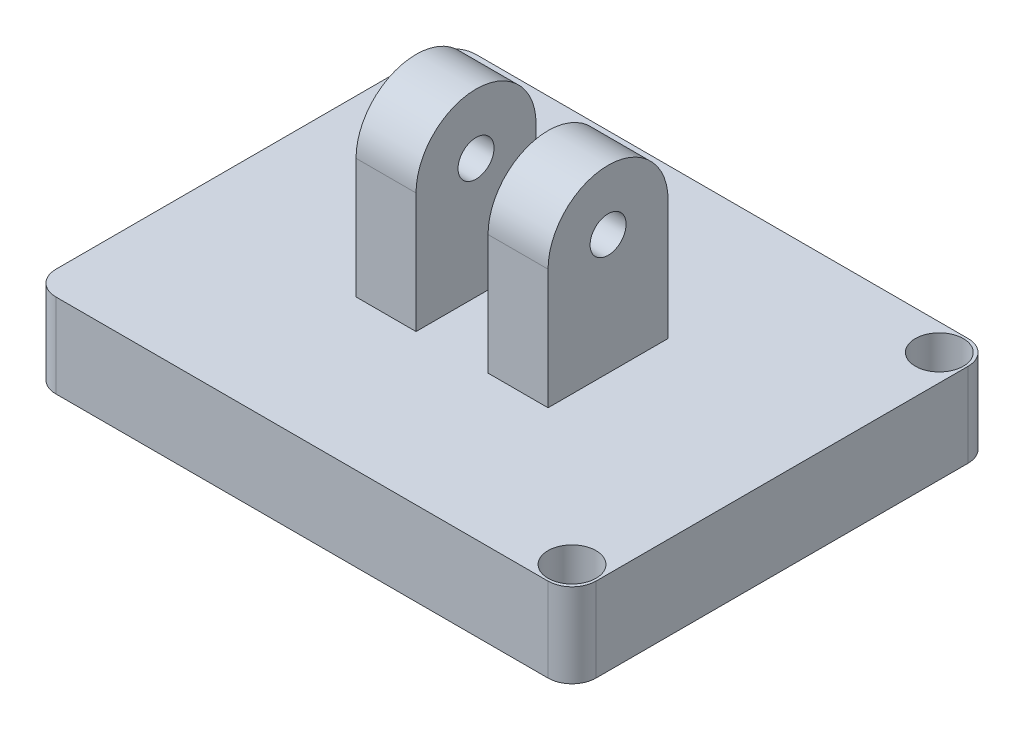
ISO-10303-21;
HEADER;
FILE_DESCRIPTION(('STEP AP214'),'2;1');
FILE_NAME('part.step','',(''),(''),'','','');
FILE_SCHEMA(('AUTOMOTIVE_DESIGN { 1 0 10303 214 1 1 1 1 }'));
ENDSEC;
DATA;
#1=APPLICATION_CONTEXT('core data for automotive mechanical design processes');
#2=APPLICATION_PROTOCOL_DEFINITION('international standard','automotive_design',2000,#1);
#3=PRODUCT_CONTEXT('',#1,'mechanical');
#4=PRODUCT('Part','Part','',(#3));
#5=PRODUCT_RELATED_PRODUCT_CATEGORY('part','',(#4));
#6=PRODUCT_DEFINITION_FORMATION('','',#4);
#7=PRODUCT_DEFINITION_CONTEXT('part definition',#1,'design');
#8=PRODUCT_DEFINITION('design','',#6,#7);
#9=PRODUCT_DEFINITION_SHAPE('','',#8);
#10=(LENGTH_UNIT() NAMED_UNIT(*) SI_UNIT(.MILLI.,.METRE.));
#11=(NAMED_UNIT(*) PLANE_ANGLE_UNIT() SI_UNIT($,.RADIAN.));
#12=(NAMED_UNIT(*) SI_UNIT($,.STERADIAN.) SOLID_ANGLE_UNIT());
#13=UNCERTAINTY_MEASURE_WITH_UNIT(LENGTH_MEASURE(1.E-05),#10,'distance_accuracy_value','');
#14=(GEOMETRIC_REPRESENTATION_CONTEXT(3) GLOBAL_UNCERTAINTY_ASSIGNED_CONTEXT((#13)) GLOBAL_UNIT_ASSIGNED_CONTEXT((#10,
#11,#12)) REPRESENTATION_CONTEXT('',''));
#15=CARTESIAN_POINT('',(0.,0.,0.));
#16=DIRECTION('',(0.,0.,1.));
#17=DIRECTION('',(1.,0.,0.));
#18=AXIS2_PLACEMENT_3D('',#15,#16,#17);
#19=CARTESIAN_POINT('',(8.,17.,-5.00500000000001));
#20=DIRECTION('',(0.,0.,1.));
#21=DIRECTION('',(0.,-1.,0.));
#22=AXIS2_PLACEMENT_3D('',#19,#20,#21);
#23=PLANE('',#22);
#24=DIRECTION('',(0.,1.,0.));
#25=VECTOR('',#24,1.);
#26=CARTESIAN_POINT('',(-3.,17.,-5.00500000000001));
#27=LINE('',#26,#25);
#28=CARTESIAN_POINT('',(-3.,7.,-5.00500000000001));
#29=VERTEX_POINT('',#28);
#30=CARTESIAN_POINT('',(-3.,17.,-5.00500000000001));
#31=VERTEX_POINT('',#30);
#32=EDGE_CURVE('E153',#29,#31,#27,.T.);
#33=ORIENTED_EDGE('',*,*,#32,.F.);
#34=DIRECTION('',(-1.,0.,0.));
#35=VECTOR('',#34,1.);
#36=CARTESIAN_POINT('',(8.,7.,-5.00500000000001));
#37=LINE('',#36,#35);
#38=CARTESIAN_POINT('',(-8.,7.,-5.00500000000001));
#39=VERTEX_POINT('',#38);
#40=EDGE_CURVE('E164',#29,#39,#37,.T.);
#41=ORIENTED_EDGE('',*,*,#40,.T.);
#42=DIRECTION('',(0.,1.,0.));
#43=VECTOR('',#42,1.);
#44=CARTESIAN_POINT('',(-8.,17.,-5.00500000000001));
#45=LINE('',#44,#43);
#46=CARTESIAN_POINT('',(-8.,17.,-5.00500000000001));
#47=VERTEX_POINT('',#46);
#48=EDGE_CURVE('E340',#39,#47,#45,.T.);
#49=ORIENTED_EDGE('',*,*,#48,.T.);
#50=DIRECTION('',(-1.,0.,0.));
#51=VECTOR('',#50,1.);
#52=CARTESIAN_POINT('',(8.,17.,-5.00500000000001));
#53=LINE('',#52,#51);
#54=EDGE_CURVE('E166',#31,#47,#53,.T.);
#55=ORIENTED_EDGE('',*,*,#54,.F.);
#56=EDGE_LOOP('',(#33,#41,#49,#55));
#57=FACE_BOUND('',#56,.T.);
#58=ADVANCED_FACE('F38',(#57),#23,.F.);
#59=CARTESIAN_POINT('',(8.,17.,-0.00500000000000671));
#60=DIRECTION('',(-1.,0.,0.));
#61=DIRECTION('',(0.,0.,1.));
#62=AXIS2_PLACEMENT_3D('',#59,#60,#61);
#63=CYLINDRICAL_SURFACE('',#62,5.);
#64=CARTESIAN_POINT('',(-3.,17.,-0.00500000000000734));
#65=DIRECTION('',(1.,0.,0.));
#66=DIRECTION('',(0.,0.,-1.));
#67=AXIS2_PLACEMENT_3D('',#64,#65,#66);
#68=CIRCLE('',#67,5.);
#69=CARTESIAN_POINT('',(-3.,17.,4.99499999999999));
#70=VERTEX_POINT('',#69);
#71=EDGE_CURVE('E167',#31,#70,#68,.T.);
#72=ORIENTED_EDGE('',*,*,#71,.F.);
#73=ORIENTED_EDGE('',*,*,#54,.T.);
#74=CARTESIAN_POINT('',(-8.,17.,-0.00500000000000763));
#75=DIRECTION('',(1.,0.,0.));
#76=DIRECTION('',(0.,0.,-1.));
#77=AXIS2_PLACEMENT_3D('',#74,#75,#76);
#78=CIRCLE('',#77,5.);
#79=CARTESIAN_POINT('',(-8.,17.,4.99499999999999));
#80=VERTEX_POINT('',#79);
#81=EDGE_CURVE('E342',#47,#80,#78,.T.);
#82=ORIENTED_EDGE('',*,*,#81,.T.);
#83=DIRECTION('',(-1.,0.,0.));
#84=VECTOR('',#83,1.);
#85=CARTESIAN_POINT('',(8.,17.,4.99499999999999));
#86=LINE('',#85,#84);
#87=EDGE_CURVE('E349',#70,#80,#86,.T.);
#88=ORIENTED_EDGE('',*,*,#87,.F.);
#89=EDGE_LOOP('',(#72,#73,#82,#88));
#90=FACE_BOUND('',#89,.T.);
#91=ADVANCED_FACE('F292',(#90),#63,.T.);
#92=CARTESIAN_POINT('',(8.,7.,4.99499999999999));
#93=DIRECTION('',(0.,0.,-1.));
#94=DIRECTION('',(-1.,0.,0.));
#95=AXIS2_PLACEMENT_3D('',#92,#93,#94);
#96=PLANE('',#95);
#97=DIRECTION('',(0.,-1.,0.));
#98=VECTOR('',#97,1.);
#99=CARTESIAN_POINT('',(-3.,7.,4.99499999999999));
#100=LINE('',#99,#98);
#101=CARTESIAN_POINT('',(-3.,7.,4.99499999999999));
#102=VERTEX_POINT('',#101);
#103=EDGE_CURVE('E156',#70,#102,#100,.T.);
#104=ORIENTED_EDGE('',*,*,#103,.F.);
#105=ORIENTED_EDGE('',*,*,#87,.T.);
#106=DIRECTION('',(0.,-1.,0.));
#107=VECTOR('',#106,1.);
#108=CARTESIAN_POINT('',(-8.,7.,4.99499999999999));
#109=LINE('',#108,#107);
#110=CARTESIAN_POINT('',(-8.,7.,4.99499999999999));
#111=VERTEX_POINT('',#110);
#112=EDGE_CURVE('E331',#80,#111,#109,.T.);
#113=ORIENTED_EDGE('',*,*,#112,.T.);
#114=DIRECTION('',(-1.,0.,0.));
#115=VECTOR('',#114,1.);
#116=CARTESIAN_POINT('',(8.,7.,4.99499999999999));
#117=LINE('',#116,#115);
#118=EDGE_CURVE('E339',#102,#111,#117,.T.);
#119=ORIENTED_EDGE('',*,*,#118,.F.);
#120=EDGE_LOOP('',(#104,#105,#113,#119));
#121=FACE_BOUND('',#120,.T.);
#122=ADVANCED_FACE('F298',(#121),#96,.F.);
#123=CARTESIAN_POINT('',(8.,17.,-0.00500000000000671));
#124=DIRECTION('',(-1.,0.,0.));
#125=DIRECTION('',(0.,0.,1.));
#126=AXIS2_PLACEMENT_3D('',#123,#124,#125);
#127=CYLINDRICAL_SURFACE('',#126,1.5);
#128=CARTESIAN_POINT('',(-8.,17.,-0.00500000000000763));
#129=DIRECTION('',(1.,0.,0.));
#130=DIRECTION('',(0.,0.,-1.));
#131=AXIS2_PLACEMENT_3D('',#128,#129,#130);
#132=CIRCLE('',#131,1.5);
#133=CARTESIAN_POINT('',(-8.,17.,-1.50500000000001));
#134=VERTEX_POINT('',#133);
#135=EDGE_CURVE('E334',#134,#134,#132,.T.);
#136=ORIENTED_EDGE('',*,*,#135,.F.);
#137=EDGE_LOOP('',(#136));
#138=FACE_BOUND('',#137,.T.);
#139=CARTESIAN_POINT('',(-3.,17.,-0.00500000000000734));
#140=DIRECTION('',(1.,0.,0.));
#141=DIRECTION('',(0.,0.,-1.));
#142=AXIS2_PLACEMENT_3D('',#139,#140,#141);
#143=CIRCLE('',#142,1.5);
#144=CARTESIAN_POINT('',(-3.,17.,-1.50500000000001));
#145=VERTEX_POINT('',#144);
#146=EDGE_CURVE('E368',#145,#145,#143,.T.);
#147=ORIENTED_EDGE('',*,*,#146,.T.);
#148=EDGE_LOOP('',(#147));
#149=FACE_BOUND('',#148,.T.);
#150=ADVANCED_FACE('F382',(#138,#149),#127,.F.);
#151=CARTESIAN_POINT('',(0.,7.,0.));
#152=DIRECTION('',(0.,-1.,0.));
#153=DIRECTION('',(0.,0.,-1.));
#154=AXIS2_PLACEMENT_3D('',#151,#152,#153);
#155=PLANE('',#154);
#156=DIRECTION('',(0.,0.,-1.));
#157=VECTOR('',#156,1.);
#158=CARTESIAN_POINT('',(3.,7.,-0.00500000000000613));
#159=LINE('',#158,#157);
#160=CARTESIAN_POINT('',(3.,7.,4.99499999999999));
#161=VERTEX_POINT('',#160);
#162=CARTESIAN_POINT('',(3.,7.,-5.00500000000001));
#163=VERTEX_POINT('',#162);
#164=EDGE_CURVE('E53',#161,#163,#159,.T.);
#165=ORIENTED_EDGE('',*,*,#164,.T.);
#166=CARTESIAN_POINT('',(8.,7.,-5.00500000000001));
#167=VERTEX_POINT('',#166);
#168=EDGE_CURVE('E60',#167,#163,#37,.T.);
#169=ORIENTED_EDGE('',*,*,#168,.F.);
#170=DIRECTION('',(0.,0.,-1.));
#171=VECTOR('',#170,1.);
#172=CARTESIAN_POINT('',(8.,7.,-5.00500000000001));
#173=LINE('',#172,#171);
#174=CARTESIAN_POINT('',(8.,7.,4.99499999999999));
#175=VERTEX_POINT('',#174);
#176=EDGE_CURVE('E322',#175,#167,#173,.T.);
#177=ORIENTED_EDGE('',*,*,#176,.F.);
#178=EDGE_CURVE('E348',#175,#161,#117,.T.);
#179=ORIENTED_EDGE('',*,*,#178,.T.);
#180=EDGE_LOOP('',(#165,#169,#177,#179));
#181=FACE_BOUND('',#180,.T.);
#182=DIRECTION('',(-1.,0.,0.));
#183=VECTOR('',#182,1.);
#184=CARTESIAN_POINT('',(-22.5,7.,-17.5));
#185=LINE('',#184,#183);
#186=CARTESIAN_POINT('',(20.5,7.,-17.5));
#187=VERTEX_POINT('',#186);
#188=CARTESIAN_POINT('',(-20.5,7.,-17.5));
#189=VERTEX_POINT('',#188);
#190=EDGE_CURVE('E195',#187,#189,#185,.T.);
#191=ORIENTED_EDGE('',*,*,#190,.T.);
#192=CARTESIAN_POINT('',(-20.5,7.,-15.5));
#193=DIRECTION('',(0.,-1.,0.));
#194=DIRECTION('',(0.,0.,-1.));
#195=AXIS2_PLACEMENT_3D('',#192,#193,#194);
#196=CIRCLE('',#195,2.);
#197=CARTESIAN_POINT('',(-22.5,7.,-15.5));
#198=VERTEX_POINT('',#197);
#199=EDGE_CURVE('E239',#189,#198,#196,.F.);
#200=ORIENTED_EDGE('',*,*,#199,.T.);
#201=DIRECTION('',(0.,0.,1.));
#202=VECTOR('',#201,1.);
#203=CARTESIAN_POINT('',(-22.5,7.,17.5));
#204=LINE('',#203,#202);
#205=CARTESIAN_POINT('',(-22.5,7.,15.5));
#206=VERTEX_POINT('',#205);
#207=EDGE_CURVE('E199',#198,#206,#204,.T.);
#208=ORIENTED_EDGE('',*,*,#207,.T.);
#209=CARTESIAN_POINT('',(-20.5,7.,15.5));
#210=DIRECTION('',(0.,-1.,0.));
#211=DIRECTION('',(0.,0.,-1.));
#212=AXIS2_PLACEMENT_3D('',#209,#210,#211);
#213=CIRCLE('',#212,2.);
#214=CARTESIAN_POINT('',(-20.5,7.,17.5));
#215=VERTEX_POINT('',#214);
#216=EDGE_CURVE('E235',#206,#215,#213,.F.);
#217=ORIENTED_EDGE('',*,*,#216,.T.);
#218=DIRECTION('',(1.,0.,0.));
#219=VECTOR('',#218,1.);
#220=CARTESIAN_POINT('',(-22.5,7.,17.5));
#221=LINE('',#220,#219);
#222=CARTESIAN_POINT('',(20.5,7.,17.5));
#223=VERTEX_POINT('',#222);
#224=EDGE_CURVE('E202',#215,#223,#221,.T.);
#225=ORIENTED_EDGE('',*,*,#224,.T.);
#226=CARTESIAN_POINT('',(20.5,7.,15.5));
#227=DIRECTION('',(0.,-1.,0.));
#228=DIRECTION('',(0.,0.,-1.));
#229=AXIS2_PLACEMENT_3D('',#226,#227,#228);
#230=CIRCLE('',#229,2.);
#231=CARTESIAN_POINT('',(22.5,7.,15.5));
#232=VERTEX_POINT('',#231);
#233=EDGE_CURVE('E233',#223,#232,#230,.F.);
#234=ORIENTED_EDGE('',*,*,#233,.T.);
#235=DIRECTION('',(0.,0.,-1.));
#236=VECTOR('',#235,1.);
#237=CARTESIAN_POINT('',(22.5,7.,17.5));
#238=LINE('',#237,#236);
#239=CARTESIAN_POINT('',(22.5,7.,-15.5));
#240=VERTEX_POINT('',#239);
#241=EDGE_CURVE('E192',#232,#240,#238,.T.);
#242=ORIENTED_EDGE('',*,*,#241,.T.);
#243=CARTESIAN_POINT('',(20.5,7.,-15.5));
#244=DIRECTION('',(0.,-1.,0.));
#245=DIRECTION('',(0.,0.,-1.));
#246=AXIS2_PLACEMENT_3D('',#243,#244,#245);
#247=CIRCLE('',#246,2.);
#248=EDGE_CURVE('E237',#240,#187,#247,.F.);
#249=ORIENTED_EDGE('',*,*,#248,.T.);
#250=EDGE_LOOP('',(#191,#200,#208,#217,#225,#234,#242,#249));
#251=FACE_BOUND('',#250,.T.);
#252=CARTESIAN_POINT('',(20.3,7.,15.3));
#253=DIRECTION('',(0.,1.,0.));
#254=DIRECTION('',(0.,0.,1.));
#255=AXIS2_PLACEMENT_3D('',#252,#253,#254);
#256=CIRCLE('',#255,2.);
#257=CARTESIAN_POINT('',(20.3,7.,17.3));
#258=VERTEX_POINT('',#257);
#259=EDGE_CURVE('E175',#258,#258,#256,.T.);
#260=ORIENTED_EDGE('',*,*,#259,.F.);
#261=EDGE_LOOP('',(#260));
#262=FACE_BOUND('',#261,.T.);
#263=CARTESIAN_POINT('',(20.3,7.,-15.3));
#264=DIRECTION('',(0.,1.,0.));
#265=DIRECTION('',(0.,0.,1.));
#266=AXIS2_PLACEMENT_3D('',#263,#264,#265);
#267=CIRCLE('',#266,2.);
#268=CARTESIAN_POINT('',(20.3,7.,-13.3));
#269=VERTEX_POINT('',#268);
#270=EDGE_CURVE('E184',#269,#269,#267,.T.);
#271=ORIENTED_EDGE('',*,*,#270,.F.);
#272=EDGE_LOOP('',(#271));
#273=FACE_BOUND('',#272,.T.);
#274=ORIENTED_EDGE('',*,*,#40,.F.);
#275=DIRECTION('',(0.,0.,-1.));
#276=VECTOR('',#275,1.);
#277=CARTESIAN_POINT('',(-3.,7.,-5.00500000000001));
#278=LINE('',#277,#276);
#279=EDGE_CURVE('E150',#102,#29,#278,.T.);
#280=ORIENTED_EDGE('',*,*,#279,.F.);
#281=ORIENTED_EDGE('',*,*,#118,.T.);
#282=DIRECTION('',(0.,0.,-1.));
#283=VECTOR('',#282,1.);
#284=CARTESIAN_POINT('',(-8.,7.,-0.00500000000000676));
#285=LINE('',#284,#283);
#286=EDGE_CURVE('E171',#111,#39,#285,.T.);
#287=ORIENTED_EDGE('',*,*,#286,.T.);
#288=EDGE_LOOP('',(#274,#280,#281,#287));
#289=FACE_BOUND('',#288,.T.);
#290=ADVANCED_FACE('F169',(#181,#251,#262,#273,#289),#155,.F.);
#291=CARTESIAN_POINT('',(22.5,7.,17.5));
#292=DIRECTION('',(-1.,0.,0.));
#293=DIRECTION('',(0.,0.,1.));
#294=AXIS2_PLACEMENT_3D('',#291,#292,#293);
#295=PLANE('',#294);
#296=DIRECTION('',(0.,0.,-1.));
#297=VECTOR('',#296,1.);
#298=CARTESIAN_POINT('',(22.5,0.,17.5));
#299=LINE('',#298,#297);
#300=CARTESIAN_POINT('',(22.5,0.,15.5));
#301=VERTEX_POINT('',#300);
#302=CARTESIAN_POINT('',(22.5,0.,-15.5));
#303=VERTEX_POINT('',#302);
#304=EDGE_CURVE('E183',#301,#303,#299,.T.);
#305=ORIENTED_EDGE('',*,*,#304,.T.);
#306=DIRECTION('',(0.,-1.,0.));
#307=VECTOR('',#306,1.);
#308=CARTESIAN_POINT('',(22.5,7.,-15.5));
#309=LINE('',#308,#307);
#310=EDGE_CURVE('E244',#303,#240,#309,.F.);
#311=ORIENTED_EDGE('',*,*,#310,.T.);
#312=ORIENTED_EDGE('',*,*,#241,.F.);
#313=DIRECTION('',(0.,-1.,0.));
#314=VECTOR('',#313,1.);
#315=CARTESIAN_POINT('',(22.5,7.,15.5));
#316=LINE('',#315,#314);
#317=EDGE_CURVE('E241',#232,#301,#316,.T.);
#318=ORIENTED_EDGE('',*,*,#317,.T.);
#319=EDGE_LOOP('',(#305,#311,#312,#318));
#320=FACE_BOUND('',#319,.T.);
#321=ADVANCED_FACE('F260',(#320),#295,.F.);
#322=CARTESIAN_POINT('',(-22.5,7.,-17.5));
#323=DIRECTION('',(0.,0.,1.));
#324=DIRECTION('',(1.,0.,0.));
#325=AXIS2_PLACEMENT_3D('',#322,#323,#324);
#326=PLANE('',#325);
#327=DIRECTION('',(-1.,0.,0.));
#328=VECTOR('',#327,1.);
#329=CARTESIAN_POINT('',(-22.5,0.,-17.5));
#330=LINE('',#329,#328);
#331=CARTESIAN_POINT('',(20.5,0.,-17.5));
#332=VERTEX_POINT('',#331);
#333=CARTESIAN_POINT('',(-20.5,0.,-17.5));
#334=VERTEX_POINT('',#333);
#335=EDGE_CURVE('E208',#332,#334,#330,.T.);
#336=ORIENTED_EDGE('',*,*,#335,.T.);
#337=DIRECTION('',(0.,-1.,0.));
#338=VECTOR('',#337,1.);
#339=CARTESIAN_POINT('',(-20.5,7.,-17.5));
#340=LINE('',#339,#338);
#341=EDGE_CURVE('E231',#334,#189,#340,.F.);
#342=ORIENTED_EDGE('',*,*,#341,.T.);
#343=ORIENTED_EDGE('',*,*,#190,.F.);
#344=DIRECTION('',(0.,-1.,0.));
#345=VECTOR('',#344,1.);
#346=CARTESIAN_POINT('',(20.5,7.,-17.5));
#347=LINE('',#346,#345);
#348=EDGE_CURVE('E228',#187,#332,#347,.T.);
#349=ORIENTED_EDGE('',*,*,#348,.T.);
#350=EDGE_LOOP('',(#336,#342,#343,#349));
#351=FACE_BOUND('',#350,.T.);
#352=ADVANCED_FACE('F272',(#351),#326,.F.);
#353=CARTESIAN_POINT('',(-22.5,7.,17.5));
#354=DIRECTION('',(1.,0.,0.));
#355=DIRECTION('',(0.,0.,-1.));
#356=AXIS2_PLACEMENT_3D('',#353,#354,#355);
#357=PLANE('',#356);
#358=ORIENTED_EDGE('',*,*,#207,.F.);
#359=DIRECTION('',(0.,-1.,0.));
#360=VECTOR('',#359,1.);
#361=CARTESIAN_POINT('',(-22.5,7.,-15.5));
#362=LINE('',#361,#360);
#363=CARTESIAN_POINT('',(-22.5,0.,-15.5));
#364=VERTEX_POINT('',#363);
#365=EDGE_CURVE('E217',#198,#364,#362,.T.);
#366=ORIENTED_EDGE('',*,*,#365,.T.);
#367=DIRECTION('',(0.,0.,1.));
#368=VECTOR('',#367,1.);
#369=CARTESIAN_POINT('',(-22.5,0.,17.5));
#370=LINE('',#369,#368);
#371=CARTESIAN_POINT('',(-22.5,0.,15.5));
#372=VERTEX_POINT('',#371);
#373=EDGE_CURVE('E211',#364,#372,#370,.T.);
#374=ORIENTED_EDGE('',*,*,#373,.T.);
#375=DIRECTION('',(0.,-1.,0.));
#376=VECTOR('',#375,1.);
#377=CARTESIAN_POINT('',(-22.5,7.,15.5));
#378=LINE('',#377,#376);
#379=EDGE_CURVE('E205',#372,#206,#378,.F.);
#380=ORIENTED_EDGE('',*,*,#379,.T.);
#381=EDGE_LOOP('',(#358,#366,#374,#380));
#382=FACE_BOUND('',#381,.T.);
#383=ADVANCED_FACE('F280',(#382),#357,.F.);
#384=CARTESIAN_POINT('',(-22.5,7.,17.5));
#385=DIRECTION('',(0.,0.,-1.));
#386=DIRECTION('',(-1.,0.,0.));
#387=AXIS2_PLACEMENT_3D('',#384,#385,#386);
#388=PLANE('',#387);
#389=ORIENTED_EDGE('',*,*,#224,.F.);
#390=DIRECTION('',(0.,-1.,0.));
#391=VECTOR('',#390,1.);
#392=CARTESIAN_POINT('',(-20.5,7.,17.5));
#393=LINE('',#392,#391);
#394=CARTESIAN_POINT('',(-20.5,0.,17.5));
#395=VERTEX_POINT('',#394);
#396=EDGE_CURVE('E11',#215,#395,#393,.T.);
#397=ORIENTED_EDGE('',*,*,#396,.T.);
#398=DIRECTION('',(1.,0.,0.));
#399=VECTOR('',#398,1.);
#400=CARTESIAN_POINT('',(-22.5,0.,17.5));
#401=LINE('',#400,#399);
#402=CARTESIAN_POINT('',(20.5,0.,17.5));
#403=VERTEX_POINT('',#402);
#404=EDGE_CURVE('E196',#395,#403,#401,.T.);
#405=ORIENTED_EDGE('',*,*,#404,.T.);
#406=DIRECTION('',(0.,-1.,0.));
#407=VECTOR('',#406,1.);
#408=CARTESIAN_POINT('',(20.5,7.,17.5));
#409=LINE('',#408,#407);
#410=EDGE_CURVE('E46',#403,#223,#409,.F.);
#411=ORIENTED_EDGE('',*,*,#410,.T.);
#412=EDGE_LOOP('',(#389,#397,#405,#411));
#413=FACE_BOUND('',#412,.T.);
#414=ADVANCED_FACE('F248',(#413),#388,.F.);
#415=CARTESIAN_POINT('',(0.,0.,0.));
#416=DIRECTION('',(0.,-1.,0.));
#417=DIRECTION('',(0.,0.,-1.));
#418=AXIS2_PLACEMENT_3D('',#415,#416,#417);
#419=PLANE('',#418);
#420=CARTESIAN_POINT('',(20.3,0.,-15.3));
#421=DIRECTION('',(0.,1.,0.));
#422=DIRECTION('',(0.,0.,1.));
#423=AXIS2_PLACEMENT_3D('',#420,#421,#422);
#424=CIRCLE('',#423,2.);
#425=CARTESIAN_POINT('',(20.3,0.,-13.3));
#426=VERTEX_POINT('',#425);
#427=EDGE_CURVE('E180',#426,#426,#424,.T.);
#428=ORIENTED_EDGE('',*,*,#427,.T.);
#429=EDGE_LOOP('',(#428));
#430=FACE_BOUND('',#429,.T.);
#431=CARTESIAN_POINT('',(20.3,0.,15.3));
#432=DIRECTION('',(0.,1.,0.));
#433=DIRECTION('',(0.,0.,1.));
#434=AXIS2_PLACEMENT_3D('',#431,#432,#433);
#435=CIRCLE('',#434,2.);
#436=CARTESIAN_POINT('',(20.3,0.,17.3));
#437=VERTEX_POINT('',#436);
#438=EDGE_CURVE('E187',#437,#437,#435,.T.);
#439=ORIENTED_EDGE('',*,*,#438,.T.);
#440=EDGE_LOOP('',(#439));
#441=FACE_BOUND('',#440,.T.);
#442=ORIENTED_EDGE('',*,*,#373,.F.);
#443=CARTESIAN_POINT('',(-20.5,0.,-15.5));
#444=DIRECTION('',(0.,-1.,0.));
#445=DIRECTION('',(0.,0.,-1.));
#446=AXIS2_PLACEMENT_3D('',#443,#444,#445);
#447=CIRCLE('',#446,2.);
#448=EDGE_CURVE('E226',#364,#334,#447,.T.);
#449=ORIENTED_EDGE('',*,*,#448,.T.);
#450=ORIENTED_EDGE('',*,*,#335,.F.);
#451=CARTESIAN_POINT('',(20.5,0.,-15.5));
#452=DIRECTION('',(0.,-1.,0.));
#453=DIRECTION('',(0.,0.,-1.));
#454=AXIS2_PLACEMENT_3D('',#451,#452,#453);
#455=CIRCLE('',#454,2.);
#456=EDGE_CURVE('E224',#332,#303,#455,.T.);
#457=ORIENTED_EDGE('',*,*,#456,.T.);
#458=ORIENTED_EDGE('',*,*,#304,.F.);
#459=CARTESIAN_POINT('',(20.5,0.,15.5));
#460=DIRECTION('',(0.,-1.,0.));
#461=DIRECTION('',(0.,0.,-1.));
#462=AXIS2_PLACEMENT_3D('',#459,#460,#461);
#463=CIRCLE('',#462,2.);
#464=EDGE_CURVE('E220',#301,#403,#463,.T.);
#465=ORIENTED_EDGE('',*,*,#464,.T.);
#466=ORIENTED_EDGE('',*,*,#404,.F.);
#467=CARTESIAN_POINT('',(-20.5,0.,15.5));
#468=DIRECTION('',(0.,-1.,0.));
#469=DIRECTION('',(0.,0.,-1.));
#470=AXIS2_PLACEMENT_3D('',#467,#468,#469);
#471=CIRCLE('',#470,2.);
#472=EDGE_CURVE('E222',#395,#372,#471,.T.);
#473=ORIENTED_EDGE('',*,*,#472,.T.);
#474=EDGE_LOOP('',(#442,#449,#450,#457,#458,#465,#466,#473));
#475=FACE_BOUND('',#474,.T.);
#476=ADVANCED_FACE('F264',(#430,#441,#475),#419,.T.);
#477=CARTESIAN_POINT('',(20.3,0.,15.3));
#478=DIRECTION('',(0.,1.,0.));
#479=DIRECTION('',(0.,0.,1.));
#480=AXIS2_PLACEMENT_3D('',#477,#478,#479);
#481=CYLINDRICAL_SURFACE('',#480,2.);
#482=ORIENTED_EDGE('',*,*,#438,.F.);
#483=EDGE_LOOP('',(#482));
#484=FACE_BOUND('',#483,.T.);
#485=ORIENTED_EDGE('',*,*,#259,.T.);
#486=EDGE_LOOP('',(#485));
#487=FACE_BOUND('',#486,.T.);
#488=ADVANCED_FACE('F533',(#484,#487),#481,.F.);
#489=CARTESIAN_POINT('',(20.3,0.,-15.3));
#490=DIRECTION('',(0.,1.,0.));
#491=DIRECTION('',(0.,0.,1.));
#492=AXIS2_PLACEMENT_3D('',#489,#490,#491);
#493=CYLINDRICAL_SURFACE('',#492,2.);
#494=ORIENTED_EDGE('',*,*,#427,.F.);
#495=EDGE_LOOP('',(#494));
#496=FACE_BOUND('',#495,.T.);
#497=ORIENTED_EDGE('',*,*,#270,.T.);
#498=EDGE_LOOP('',(#497));
#499=FACE_BOUND('',#498,.T.);
#500=ADVANCED_FACE('F524',(#496,#499),#493,.F.);
#501=CARTESIAN_POINT('',(-20.5,7.,-15.5));
#502=DIRECTION('',(0.,-1.,0.));
#503=DIRECTION('',(0.,0.,-1.));
#504=AXIS2_PLACEMENT_3D('',#501,#502,#503);
#505=CYLINDRICAL_SURFACE('',#504,2.);
#506=ORIENTED_EDGE('',*,*,#199,.F.);
#507=ORIENTED_EDGE('',*,*,#341,.F.);
#508=ORIENTED_EDGE('',*,*,#448,.F.);
#509=ORIENTED_EDGE('',*,*,#365,.F.);
#510=EDGE_LOOP('',(#506,#507,#508,#509));
#511=FACE_BOUND('',#510,.T.);
#512=ADVANCED_FACE('F278',(#511),#505,.T.);
#513=CARTESIAN_POINT('',(20.5,7.,-15.5));
#514=DIRECTION('',(0.,-1.,0.));
#515=DIRECTION('',(0.,0.,-1.));
#516=AXIS2_PLACEMENT_3D('',#513,#514,#515);
#517=CYLINDRICAL_SURFACE('',#516,2.);
#518=ORIENTED_EDGE('',*,*,#248,.F.);
#519=ORIENTED_EDGE('',*,*,#310,.F.);
#520=ORIENTED_EDGE('',*,*,#456,.F.);
#521=ORIENTED_EDGE('',*,*,#348,.F.);
#522=EDGE_LOOP('',(#518,#519,#520,#521));
#523=FACE_BOUND('',#522,.T.);
#524=ADVANCED_FACE('F269',(#523),#517,.T.);
#525=CARTESIAN_POINT('',(-20.5,7.,15.5));
#526=DIRECTION('',(0.,-1.,0.));
#527=DIRECTION('',(0.,0.,-1.));
#528=AXIS2_PLACEMENT_3D('',#525,#526,#527);
#529=CYLINDRICAL_SURFACE('',#528,2.);
#530=ORIENTED_EDGE('',*,*,#216,.F.);
#531=ORIENTED_EDGE('',*,*,#379,.F.);
#532=ORIENTED_EDGE('',*,*,#472,.F.);
#533=ORIENTED_EDGE('',*,*,#396,.F.);
#534=EDGE_LOOP('',(#530,#531,#532,#533));
#535=FACE_BOUND('',#534,.T.);
#536=ADVANCED_FACE('F283',(#535),#529,.T.);
#537=CARTESIAN_POINT('',(20.5,7.,15.5));
#538=DIRECTION('',(0.,-1.,0.));
#539=DIRECTION('',(0.,0.,-1.));
#540=AXIS2_PLACEMENT_3D('',#537,#538,#539);
#541=CYLINDRICAL_SURFACE('',#540,2.);
#542=ORIENTED_EDGE('',*,*,#233,.F.);
#543=ORIENTED_EDGE('',*,*,#410,.F.);
#544=ORIENTED_EDGE('',*,*,#464,.F.);
#545=ORIENTED_EDGE('',*,*,#317,.F.);
#546=EDGE_LOOP('',(#542,#543,#544,#545));
#547=FACE_BOUND('',#546,.T.);
#548=ADVANCED_FACE('F40',(#547),#541,.T.);
#549=CARTESIAN_POINT('',(8.,17.,-0.00500000000000671));
#550=DIRECTION('',(1.,0.,0.));
#551=DIRECTION('',(0.,0.,-1.));
#552=AXIS2_PLACEMENT_3D('',#549,#550,#551);
#553=PLANE('',#552);
#554=ORIENTED_EDGE('',*,*,#176,.T.);
#555=DIRECTION('',(0.,1.,0.));
#556=VECTOR('',#555,1.);
#557=CARTESIAN_POINT('',(8.,17.,-5.00500000000001));
#558=LINE('',#557,#556);
#559=CARTESIAN_POINT('',(8.,17.,-5.00500000000001));
#560=VERTEX_POINT('',#559);
#561=EDGE_CURVE('E317',#167,#560,#558,.T.);
#562=ORIENTED_EDGE('',*,*,#561,.T.);
#563=CARTESIAN_POINT('',(8.,17.,-0.00500000000000671));
#564=DIRECTION('',(1.,0.,0.));
#565=DIRECTION('',(0.,0.,-1.));
#566=AXIS2_PLACEMENT_3D('',#563,#564,#565);
#567=CIRCLE('',#566,5.);
#568=CARTESIAN_POINT('',(8.,17.,4.99499999999999));
#569=VERTEX_POINT('',#568);
#570=EDGE_CURVE('E321',#560,#569,#567,.T.);
#571=ORIENTED_EDGE('',*,*,#570,.T.);
#572=DIRECTION('',(0.,-1.,0.));
#573=VECTOR('',#572,1.);
#574=CARTESIAN_POINT('',(8.,7.,4.99499999999999));
#575=LINE('',#574,#573);
#576=EDGE_CURVE('E327',#569,#175,#575,.T.);
#577=ORIENTED_EDGE('',*,*,#576,.T.);
#578=EDGE_LOOP('',(#554,#562,#571,#577));
#579=FACE_BOUND('',#578,.T.);
#580=CARTESIAN_POINT('',(8.,17.,-0.00500000000000671));
#581=DIRECTION('',(1.,0.,0.));
#582=DIRECTION('',(0.,0.,-1.));
#583=AXIS2_PLACEMENT_3D('',#580,#581,#582);
#584=CIRCLE('',#583,1.5);
#585=CARTESIAN_POINT('',(8.,17.,-1.50500000000001));
#586=VERTEX_POINT('',#585);
#587=EDGE_CURVE('E343',#586,#586,#584,.T.);
#588=ORIENTED_EDGE('',*,*,#587,.F.);
#589=EDGE_LOOP('',(#588));
#590=FACE_BOUND('',#589,.T.);
#591=ADVANCED_FACE('F289',(#579,#590),#553,.T.);
#592=CARTESIAN_POINT('',(-8.,17.,-0.00500000000000763));
#593=DIRECTION('',(1.,0.,0.));
#594=DIRECTION('',(0.,0.,-1.));
#595=AXIS2_PLACEMENT_3D('',#592,#593,#594);
#596=PLANE('',#595);
#597=ORIENTED_EDGE('',*,*,#48,.F.);
#598=ORIENTED_EDGE('',*,*,#286,.F.);
#599=ORIENTED_EDGE('',*,*,#112,.F.);
#600=ORIENTED_EDGE('',*,*,#81,.F.);
#601=EDGE_LOOP('',(#597,#598,#599,#600));
#602=FACE_BOUND('',#601,.T.);
#603=ORIENTED_EDGE('',*,*,#135,.T.);
#604=EDGE_LOOP('',(#603));
#605=FACE_BOUND('',#604,.T.);
#606=ADVANCED_FACE('F304',(#602,#605),#596,.F.);
#607=ORIENTED_EDGE('',*,*,#168,.T.);
#608=DIRECTION('',(0.,1.,0.));
#609=VECTOR('',#608,1.);
#610=CARTESIAN_POINT('',(3.,17.,-5.00500000000001));
#611=LINE('',#610,#609);
#612=CARTESIAN_POINT('',(3.,17.,-5.00500000000001));
#613=VERTEX_POINT('',#612);
#614=EDGE_CURVE('E316',#163,#613,#611,.T.);
#615=ORIENTED_EDGE('',*,*,#614,.T.);
#616=EDGE_CURVE('E173',#560,#613,#53,.T.);
#617=ORIENTED_EDGE('',*,*,#616,.F.);
#618=ORIENTED_EDGE('',*,*,#561,.F.);
#619=EDGE_LOOP('',(#607,#615,#617,#618));
#620=FACE_BOUND('',#619,.T.);
#621=ADVANCED_FACE('F294',(#620),#23,.F.);
#622=ORIENTED_EDGE('',*,*,#616,.T.);
#623=CARTESIAN_POINT('',(3.,17.,-0.005000000000007));
#624=DIRECTION('',(1.,0.,0.));
#625=DIRECTION('',(0.,0.,-1.));
#626=AXIS2_PLACEMENT_3D('',#623,#624,#625);
#627=CIRCLE('',#626,5.);
#628=CARTESIAN_POINT('',(3.,17.,4.99499999999999));
#629=VERTEX_POINT('',#628);
#630=EDGE_CURVE('E367',#613,#629,#627,.T.);
#631=ORIENTED_EDGE('',*,*,#630,.T.);
#632=EDGE_CURVE('E350',#569,#629,#86,.T.);
#633=ORIENTED_EDGE('',*,*,#632,.F.);
#634=ORIENTED_EDGE('',*,*,#570,.F.);
#635=EDGE_LOOP('',(#622,#631,#633,#634));
#636=FACE_BOUND('',#635,.T.);
#637=ADVANCED_FACE('F301',(#636),#63,.T.);
#638=ORIENTED_EDGE('',*,*,#632,.T.);
#639=DIRECTION('',(0.,-1.,0.));
#640=VECTOR('',#639,1.);
#641=CARTESIAN_POINT('',(3.,7.,4.99499999999999));
#642=LINE('',#641,#640);
#643=EDGE_CURVE('E371',#629,#161,#642,.T.);
#644=ORIENTED_EDGE('',*,*,#643,.T.);
#645=ORIENTED_EDGE('',*,*,#178,.F.);
#646=ORIENTED_EDGE('',*,*,#576,.F.);
#647=EDGE_LOOP('',(#638,#644,#645,#646));
#648=FACE_BOUND('',#647,.T.);
#649=ADVANCED_FACE('F310',(#648),#96,.F.);
#650=CARTESIAN_POINT('',(3.,17.,-0.005000000000007));
#651=DIRECTION('',(1.,0.,0.));
#652=DIRECTION('',(0.,0.,-1.));
#653=AXIS2_PLACEMENT_3D('',#650,#651,#652);
#654=CIRCLE('',#653,1.5);
#655=CARTESIAN_POINT('',(3.,17.,-1.50500000000001));
#656=VERTEX_POINT('',#655);
#657=EDGE_CURVE('E616',#656,#656,#654,.T.);
#658=ORIENTED_EDGE('',*,*,#657,.F.);
#659=EDGE_LOOP('',(#658));
#660=FACE_BOUND('',#659,.T.);
#661=ORIENTED_EDGE('',*,*,#587,.T.);
#662=EDGE_LOOP('',(#661));
#663=FACE_BOUND('',#662,.T.);
#664=ADVANCED_FACE('F375',(#660,#663),#127,.F.);
#665=CARTESIAN_POINT('',(-3.,17.,-0.00500000000000734));
#666=DIRECTION('',(1.,0.,0.));
#667=DIRECTION('',(0.,0.,-1.));
#668=AXIS2_PLACEMENT_3D('',#665,#666,#667);
#669=PLANE('',#668);
#670=ORIENTED_EDGE('',*,*,#146,.F.);
#671=EDGE_LOOP('',(#670));
#672=FACE_BOUND('',#671,.T.);
#673=ORIENTED_EDGE('',*,*,#279,.T.);
#674=ORIENTED_EDGE('',*,*,#32,.T.);
#675=ORIENTED_EDGE('',*,*,#71,.T.);
#676=ORIENTED_EDGE('',*,*,#103,.T.);
#677=EDGE_LOOP('',(#673,#674,#675,#676));
#678=FACE_BOUND('',#677,.T.);
#679=ADVANCED_FACE('F152',(#672,#678),#669,.T.);
#680=CARTESIAN_POINT('',(3.,17.,-0.005000000000007));
#681=DIRECTION('',(1.,0.,0.));
#682=DIRECTION('',(0.,0.,-1.));
#683=AXIS2_PLACEMENT_3D('',#680,#681,#682);
#684=PLANE('',#683);
#685=ORIENTED_EDGE('',*,*,#657,.T.);
#686=EDGE_LOOP('',(#685));
#687=FACE_BOUND('',#686,.T.);
#688=ORIENTED_EDGE('',*,*,#164,.F.);
#689=ORIENTED_EDGE('',*,*,#643,.F.);
#690=ORIENTED_EDGE('',*,*,#630,.F.);
#691=ORIENTED_EDGE('',*,*,#614,.F.);
#692=EDGE_LOOP('',(#688,#689,#690,#691));
#693=FACE_BOUND('',#692,.T.);
#694=ADVANCED_FACE('F373',(#687,#693),#684,.F.);
#695=CLOSED_SHELL('',(#58,#91,#122,#150,#290,#321,#352,#383,#414,#476,#488,#500,#512,#524,#536,
#548,#591,#606,#621,#637,#649,#664,#679,#694));
#696=MANIFOLD_SOLID_BREP('B2',#695);
#697=ADVANCED_BREP_SHAPE_REPRESENTATION('',(#18,#696),#14);
#698=SHAPE_DEFINITION_REPRESENTATION(#9,#697);
ENDSEC;
END-ISO-10303-21;
